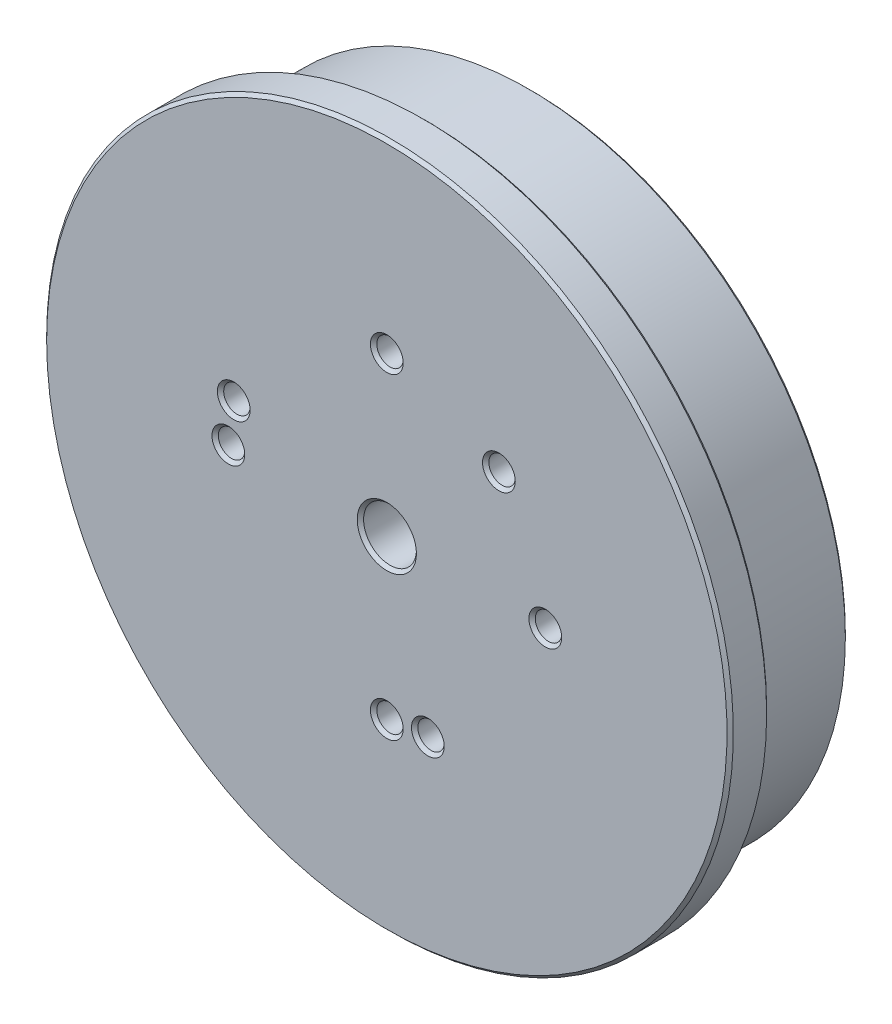
ISO-10303-21;
HEADER;
FILE_DESCRIPTION(('STEP AP214'),'2;1');
FILE_NAME('part.step','',(''),(''),'','','');
FILE_SCHEMA(('AUTOMOTIVE_DESIGN { 1 0 10303 214 1 1 1 1 }'));
ENDSEC;
DATA;
#1=APPLICATION_CONTEXT('core data for automotive mechanical design processes');
#2=APPLICATION_PROTOCOL_DEFINITION('international standard','automotive_design',2000,#1);
#3=PRODUCT_CONTEXT('',#1,'mechanical');
#4=PRODUCT('Part','Part','',(#3));
#5=PRODUCT_RELATED_PRODUCT_CATEGORY('part','',(#4));
#6=PRODUCT_DEFINITION_FORMATION('','',#4);
#7=PRODUCT_DEFINITION_CONTEXT('part definition',#1,'design');
#8=PRODUCT_DEFINITION('design','',#6,#7);
#9=PRODUCT_DEFINITION_SHAPE('','',#8);
#10=(LENGTH_UNIT() NAMED_UNIT(*) SI_UNIT(.MILLI.,.METRE.));
#11=(NAMED_UNIT(*) PLANE_ANGLE_UNIT() SI_UNIT($,.RADIAN.));
#12=(NAMED_UNIT(*) SI_UNIT($,.STERADIAN.) SOLID_ANGLE_UNIT());
#13=UNCERTAINTY_MEASURE_WITH_UNIT(LENGTH_MEASURE(1.E-05),#10,'distance_accuracy_value','');
#14=(GEOMETRIC_REPRESENTATION_CONTEXT(3) GLOBAL_UNCERTAINTY_ASSIGNED_CONTEXT((#13)) GLOBAL_UNIT_ASSIGNED_CONTEXT((#10,
#11,#12)) REPRESENTATION_CONTEXT('',''));
#15=CARTESIAN_POINT('',(0.,0.,0.));
#16=DIRECTION('',(0.,0.,1.));
#17=DIRECTION('',(1.,0.,0.));
#18=AXIS2_PLACEMENT_3D('',#15,#16,#17);
#19=CARTESIAN_POINT('',(0.,0.,25.4));
#20=DIRECTION('',(0.,0.,-1.));
#21=DIRECTION('',(-1.,0.,0.));
#22=AXIS2_PLACEMENT_3D('',#19,#20,#21);
#23=CYLINDRICAL_SURFACE('',#22,76.073);
#24=CARTESIAN_POINT('',(0.,0.,0.761999999999985));
#25=DIRECTION('',(0.,0.,1.));
#26=DIRECTION('',(1.,0.,0.));
#27=AXIS2_PLACEMENT_3D('',#24,#25,#26);
#28=CIRCLE('',#27,76.073);
#29=CARTESIAN_POINT('',(76.073,0.,0.761999999999985));
#30=VERTEX_POINT('',#29);
#31=EDGE_CURVE('E169',#30,#30,#28,.T.);
#32=ORIENTED_EDGE('',*,*,#31,.T.);
#33=EDGE_LOOP('',(#32));
#34=FACE_BOUND('',#33,.T.);
#35=CARTESIAN_POINT('',(0.,0.,25.4));
#36=DIRECTION('',(0.,0.,1.));
#37=DIRECTION('',(1.,0.,0.));
#38=AXIS2_PLACEMENT_3D('',#35,#36,#37);
#39=CIRCLE('',#38,76.073);
#40=CARTESIAN_POINT('',(76.073,0.,25.4));
#41=VERTEX_POINT('',#40);
#42=EDGE_CURVE('E172',#41,#41,#39,.T.);
#43=ORIENTED_EDGE('',*,*,#42,.F.);
#44=EDGE_LOOP('',(#43));
#45=FACE_BOUND('',#44,.T.);
#46=ADVANCED_FACE('F49',(#34,#45),#23,.T.);
#47=CARTESIAN_POINT('',(0.,0.,0.));
#48=DIRECTION('',(0.,0.,1.));
#49=DIRECTION('',(1.,0.,0.));
#50=AXIS2_PLACEMENT_3D('',#47,#48,#49);
#51=PLANE('',#50);
#52=CARTESIAN_POINT('',(0.,0.,0.));
#53=DIRECTION('',(0.,0.,1.));
#54=DIRECTION('',(1.,0.,0.));
#55=AXIS2_PLACEMENT_3D('',#52,#53,#54);
#56=CIRCLE('',#55,75.311);
#57=CARTESIAN_POINT('',(75.311,0.,0.));
#58=VERTEX_POINT('',#57);
#59=EDGE_CURVE('E142',#58,#58,#56,.F.);
#60=ORIENTED_EDGE('',*,*,#59,.T.);
#61=EDGE_LOOP('',(#60));
#62=FACE_BOUND('',#61,.T.);
#63=CARTESIAN_POINT('',(26.9407683632075,26.9407683632074,0.));
#64=DIRECTION('',(0.,0.,1.));
#65=DIRECTION('',(1.,0.,0.));
#66=AXIS2_PLACEMENT_3D('',#63,#64,#65);
#67=CIRCLE('',#66,3.937);
#68=CARTESIAN_POINT('',(30.8777683632075,26.9407683632074,0.));
#69=VERTEX_POINT('',#68);
#70=EDGE_CURVE('E145',#69,#69,#67,.T.);
#71=ORIENTED_EDGE('',*,*,#70,.T.);
#72=EDGE_LOOP('',(#71));
#73=FACE_BOUND('',#72,.T.);
#74=CARTESIAN_POINT('',(38.1,0.,0.));
#75=DIRECTION('',(0.,0.,1.));
#76=DIRECTION('',(1.,0.,0.));
#77=AXIS2_PLACEMENT_3D('',#74,#75,#76);
#78=CIRCLE('',#77,3.937);
#79=CARTESIAN_POINT('',(42.037,0.,0.));
#80=VERTEX_POINT('',#79);
#81=EDGE_CURVE('E148',#80,#80,#78,.T.);
#82=ORIENTED_EDGE('',*,*,#81,.T.);
#83=EDGE_LOOP('',(#82));
#84=FACE_BOUND('',#83,.T.);
#85=CARTESIAN_POINT('',(0.,38.1,0.));
#86=DIRECTION('',(0.,0.,1.));
#87=DIRECTION('',(1.,0.,0.));
#88=AXIS2_PLACEMENT_3D('',#85,#86,#87);
#89=CIRCLE('',#88,3.937);
#90=CARTESIAN_POINT('',(3.937,38.1,0.));
#91=VERTEX_POINT('',#90);
#92=EDGE_CURVE('E151',#91,#91,#89,.T.);
#93=ORIENTED_EDGE('',*,*,#92,.T.);
#94=EDGE_LOOP('',(#93));
#95=FACE_BOUND('',#94,.T.);
#96=CARTESIAN_POINT('',(9.86100561840581,-36.8017739816136,0.));
#97=DIRECTION('',(0.,0.,1.));
#98=DIRECTION('',(1.,0.,0.));
#99=AXIS2_PLACEMENT_3D('',#96,#97,#98);
#100=CIRCLE('',#99,3.937);
#101=CARTESIAN_POINT('',(13.7980056184058,-36.8017739816136,0.));
#102=VERTEX_POINT('',#101);
#103=EDGE_CURVE('E154',#102,#102,#100,.T.);
#104=ORIENTED_EDGE('',*,*,#103,.T.);
#105=EDGE_LOOP('',(#104));
#106=FACE_BOUND('',#105,.T.);
#107=CARTESIAN_POINT('',(0.,-38.1,0.));
#108=DIRECTION('',(0.,0.,1.));
#109=DIRECTION('',(1.,0.,0.));
#110=AXIS2_PLACEMENT_3D('',#107,#108,#109);
#111=CIRCLE('',#110,3.937);
#112=CARTESIAN_POINT('',(3.937,-38.1,0.));
#113=VERTEX_POINT('',#112);
#114=EDGE_CURVE('E157',#113,#113,#111,.T.);
#115=ORIENTED_EDGE('',*,*,#114,.T.);
#116=EDGE_LOOP('',(#115));
#117=FACE_BOUND('',#116,.T.);
#118=CARTESIAN_POINT('',(-38.1,0.,0.));
#119=DIRECTION('',(0.,0.,1.));
#120=DIRECTION('',(1.,0.,0.));
#121=AXIS2_PLACEMENT_3D('',#118,#119,#120);
#122=CIRCLE('',#121,3.93700000000002);
#123=CARTESIAN_POINT('',(-34.163,0.,0.));
#124=VERTEX_POINT('',#123);
#125=EDGE_CURVE('E160',#124,#124,#122,.T.);
#126=ORIENTED_EDGE('',*,*,#125,.T.);
#127=EDGE_LOOP('',(#126));
#128=FACE_BOUND('',#127,.T.);
#129=CARTESIAN_POINT('',(-36.8017739816134,9.86100561840645,0.));
#130=DIRECTION('',(0.,0.,1.));
#131=DIRECTION('',(1.,0.,0.));
#132=AXIS2_PLACEMENT_3D('',#129,#130,#131);
#133=CIRCLE('',#132,3.937);
#134=CARTESIAN_POINT('',(-32.8647739816134,9.86100561840645,0.));
#135=VERTEX_POINT('',#134);
#136=EDGE_CURVE('E163',#135,#135,#133,.T.);
#137=ORIENTED_EDGE('',*,*,#136,.T.);
#138=EDGE_LOOP('',(#137));
#139=FACE_BOUND('',#138,.T.);
#140=CARTESIAN_POINT('',(0.,0.,0.));
#141=DIRECTION('',(0.,0.,1.));
#142=DIRECTION('',(1.,0.,0.));
#143=AXIS2_PLACEMENT_3D('',#140,#141,#142);
#144=CIRCLE('',#143,7.11200000000003);
#145=CARTESIAN_POINT('',(7.11200000000003,0.,0.));
#146=VERTEX_POINT('',#145);
#147=EDGE_CURVE('E166',#146,#146,#144,.T.);
#148=ORIENTED_EDGE('',*,*,#147,.T.);
#149=EDGE_LOOP('',(#148));
#150=FACE_BOUND('',#149,.T.);
#151=ADVANCED_FACE('F179',(#62,#73,#84,#95,#106,#117,#128,#139,#150),#51,.F.);
#152=CARTESIAN_POINT('',(0.,0.,34.925));
#153=DIRECTION('',(0.,0.,-1.));
#154=DIRECTION('',(-1.,0.,0.));
#155=AXIS2_PLACEMENT_3D('',#152,#153,#154);
#156=CYLINDRICAL_SURFACE('',#155,82.55);
#157=CARTESIAN_POINT('',(0.,0.,34.1630000000001));
#158=DIRECTION('',(0.,0.,1.));
#159=DIRECTION('',(1.,0.,0.));
#160=AXIS2_PLACEMENT_3D('',#157,#158,#159);
#161=CIRCLE('',#160,82.55);
#162=CARTESIAN_POINT('',(-82.55,0.,34.1630000000001));
#163=VERTEX_POINT('',#162);
#164=EDGE_CURVE('E57',#163,#163,#161,.F.);
#165=CARTESIAN_POINT('',(0.,0.,26.1620000000001));
#166=DIRECTION('',(0.,0.,1.));
#167=DIRECTION('',(1.,0.,0.));
#168=AXIS2_PLACEMENT_3D('',#165,#166,#167);
#169=CIRCLE('',#168,82.55);
#170=CARTESIAN_POINT('',(-82.55,0.,26.1620000000001));
#171=VERTEX_POINT('',#170);
#172=EDGE_CURVE('E61',#171,#171,#169,.T.);
#173=CARTESIAN_POINT('',(-82.55,0.,34.1630000000001));
#174=CARTESIAN_POINT('',(-82.55,0.,34.0796562500001));
#175=CARTESIAN_POINT('',(-82.55,0.,33.9963125000001));
#176=CARTESIAN_POINT('',(-82.55,0.,33.8296250000001));
#177=CARTESIAN_POINT('',(-82.55,0.,33.7462812500001));
#178=CARTESIAN_POINT('',(-82.55,0.,33.5795937500001));
#179=CARTESIAN_POINT('',(-82.55,0.,33.4962500000001));
#180=CARTESIAN_POINT('',(-82.55,0.,33.3295625000001));
#181=CARTESIAN_POINT('',(-82.55,0.,33.2462187500001));
#182=CARTESIAN_POINT('',(-82.55,0.,33.0795312500001));
#183=CARTESIAN_POINT('',(-82.55,0.,32.9961875000001));
#184=CARTESIAN_POINT('',(-82.55,0.,32.8295000000001));
#185=CARTESIAN_POINT('',(-82.55,0.,32.7461562500001));
#186=CARTESIAN_POINT('',(-82.55,0.,32.5794687500001));
#187=CARTESIAN_POINT('',(-82.55,0.,32.4961250000001));
#188=CARTESIAN_POINT('',(-82.55,0.,32.3294375000001));
#189=CARTESIAN_POINT('',(-82.55,0.,32.2460937500001));
#190=CARTESIAN_POINT('',(-82.55,0.,32.0794062500001));
#191=CARTESIAN_POINT('',(-82.55,0.,31.9960625000001));
#192=CARTESIAN_POINT('',(-82.55,0.,31.8293750000001));
#193=CARTESIAN_POINT('',(-82.55,0.,31.7460312500001));
#194=CARTESIAN_POINT('',(-82.55,0.,31.5793437500001));
#195=CARTESIAN_POINT('',(-82.55,0.,31.4960000000001));
#196=CARTESIAN_POINT('',(-82.55,0.,31.3293125000001));
#197=CARTESIAN_POINT('',(-82.55,0.,31.2459687500001));
#198=CARTESIAN_POINT('',(-82.55,0.,31.0792812500001));
#199=CARTESIAN_POINT('',(-82.55,0.,30.9959375000001));
#200=CARTESIAN_POINT('',(-82.55,0.,30.8292500000001));
#201=CARTESIAN_POINT('',(-82.55,0.,30.7459062500001));
#202=CARTESIAN_POINT('',(-82.55,0.,30.5792187500001));
#203=CARTESIAN_POINT('',(-82.55,0.,30.4958750000001));
#204=CARTESIAN_POINT('',(-82.55,0.,30.3291875000001));
#205=CARTESIAN_POINT('',(-82.55,0.,30.2458437500001));
#206=CARTESIAN_POINT('',(-82.55,0.,30.0791562500001));
#207=CARTESIAN_POINT('',(-82.55,0.,29.9958125000001));
#208=CARTESIAN_POINT('',(-82.55,0.,29.8291250000001));
#209=CARTESIAN_POINT('',(-82.55,0.,29.7457812500001));
#210=CARTESIAN_POINT('',(-82.55,0.,29.5790937500001));
#211=CARTESIAN_POINT('',(-82.55,0.,29.4957500000001));
#212=CARTESIAN_POINT('',(-82.55,0.,29.3290625000001));
#213=CARTESIAN_POINT('',(-82.55,0.,29.2457187500001));
#214=CARTESIAN_POINT('',(-82.55,0.,29.0790312500001));
#215=CARTESIAN_POINT('',(-82.55,0.,28.9956875000001));
#216=CARTESIAN_POINT('',(-82.55,0.,28.8290000000001));
#217=CARTESIAN_POINT('',(-82.55,0.,28.7456562500001));
#218=CARTESIAN_POINT('',(-82.55,0.,28.5789687500001));
#219=CARTESIAN_POINT('',(-82.55,0.,28.4956250000001));
#220=CARTESIAN_POINT('',(-82.55,0.,28.3289375000001));
#221=CARTESIAN_POINT('',(-82.55,0.,28.2455937500001));
#222=CARTESIAN_POINT('',(-82.55,0.,28.0789062500001));
#223=CARTESIAN_POINT('',(-82.55,0.,27.9955625000001));
#224=CARTESIAN_POINT('',(-82.55,0.,27.8288750000001));
#225=CARTESIAN_POINT('',(-82.55,0.,27.7455312500001));
#226=CARTESIAN_POINT('',(-82.55,0.,27.5788437500001));
#227=CARTESIAN_POINT('',(-82.55,0.,27.4955000000001));
#228=CARTESIAN_POINT('',(-82.55,0.,27.3288125000001));
#229=CARTESIAN_POINT('',(-82.55,0.,27.2454687500001));
#230=CARTESIAN_POINT('',(-82.55,0.,27.0787812500001));
#231=CARTESIAN_POINT('',(-82.55,0.,26.9954375000001));
#232=CARTESIAN_POINT('',(-82.55,0.,26.8287500000001));
#233=CARTESIAN_POINT('',(-82.55,0.,26.7454062500001));
#234=CARTESIAN_POINT('',(-82.55,0.,26.5787187500001));
#235=CARTESIAN_POINT('',(-82.55,0.,26.4953750000001));
#236=CARTESIAN_POINT('',(-82.55,0.,26.3286875000001));
#237=CARTESIAN_POINT('',(-82.55,0.,26.2453437500001));
#238=CARTESIAN_POINT('',(-82.55,0.,26.1620000000001));
#239=B_SPLINE_CURVE_WITH_KNOTS('',3,(#173,#174,#175,#176,#177,#178,#179,#180,#181,#182,#183,
#184,#185,#186,#187,#188,#189,#190,#191,#192,#193,#194,#195,#196,#197,#198,#199,#200,#201,#202,
#203,#204,#205,#206,#207,#208,#209,#210,#211,#212,#213,#214,#215,#216,#217,#218,#219,#220,#221,
#222,#223,#224,#225,#226,#227,#228,#229,#230,#231,#232,#233,#234,#235,#236,#237,#238),
.UNSPECIFIED.,.F.,.F.,(4,2,2,2,2,2,2,2,2,2,2,2,2,2,2,2,2,2,2,2,2,2,2,2,2,2,2,2,2,2,2,2,4),(0.,
0.250031249999998,0.500062499999995,0.75009375,1.000125,1.25015625,1.5001875,1.75021875,2.00025,
2.25028125,2.5003125,2.75034375,3.000375,3.25040625,3.5004375,3.75046875,4.0005,4.25053125,
4.5005625,4.75059375,5.000625,5.25065625000001,5.50068750000001,5.75071875000001,
6.00075000000001,6.25078125000001,6.50081250000001,6.75084375000001,7.00087500000001,
7.25090625000001,7.50093750000001,7.75096875000001,8.00100000000001),.UNSPECIFIED.);
#240=EDGE_CURVE('BSEAM185',#163,#171,#239,.T.);
#241=ORIENTED_EDGE('',*,*,#164,.T.);
#242=ORIENTED_EDGE('',*,*,#172,.T.);
#243=ORIENTED_EDGE('',*,*,#240,.T.);
#244=ORIENTED_EDGE('',*,*,#240,.F.);
#245=EDGE_LOOP('',(#241,#243,#242,#244));
#246=FACE_BOUND('',#245,.T.);
#247=ADVANCED_FACE('F185',(#246),#156,.T.);
#248=CARTESIAN_POINT('',(0.,0.,34.925));
#249=DIRECTION('',(0.,0.,1.));
#250=DIRECTION('',(1.,0.,0.));
#251=AXIS2_PLACEMENT_3D('',#248,#249,#250);
#252=PLANE('',#251);
#253=CARTESIAN_POINT('',(0.,0.,34.925));
#254=DIRECTION('',(0.,0.,1.));
#255=DIRECTION('',(1.,0.,0.));
#256=AXIS2_PLACEMENT_3D('',#253,#254,#255);
#257=CIRCLE('',#256,81.7880000000001);
#258=CARTESIAN_POINT('',(-81.7880000000001,0.,34.925));
#259=VERTEX_POINT('',#258);
#260=EDGE_CURVE('E65',#259,#259,#257,.T.);
#261=ORIENTED_EDGE('',*,*,#260,.T.);
#262=EDGE_LOOP('',(#261));
#263=FACE_BOUND('',#262,.T.);
#264=CARTESIAN_POINT('',(26.9407683632075,26.9407683632074,34.925));
#265=DIRECTION('',(0.,0.,1.));
#266=DIRECTION('',(1.,0.,0.));
#267=AXIS2_PLACEMENT_3D('',#264,#265,#266);
#268=CIRCLE('',#267,3.93700000000005);
#269=CARTESIAN_POINT('',(30.8777683632076,26.9407683632074,34.925));
#270=VERTEX_POINT('',#269);
#271=EDGE_CURVE('E70',#270,#270,#268,.F.);
#272=ORIENTED_EDGE('',*,*,#271,.T.);
#273=EDGE_LOOP('',(#272));
#274=FACE_BOUND('',#273,.T.);
#275=CARTESIAN_POINT('',(38.1,0.,34.925));
#276=DIRECTION('',(0.,0.,1.));
#277=DIRECTION('',(1.,0.,0.));
#278=AXIS2_PLACEMENT_3D('',#275,#276,#277);
#279=CIRCLE('',#278,3.93700000000005);
#280=CARTESIAN_POINT('',(42.0370000000001,0.,34.925));
#281=VERTEX_POINT('',#280);
#282=EDGE_CURVE('E73',#281,#281,#279,.F.);
#283=ORIENTED_EDGE('',*,*,#282,.T.);
#284=EDGE_LOOP('',(#283));
#285=FACE_BOUND('',#284,.T.);
#286=CARTESIAN_POINT('',(0.,38.1,34.925));
#287=DIRECTION('',(0.,0.,1.));
#288=DIRECTION('',(1.,0.,0.));
#289=AXIS2_PLACEMENT_3D('',#286,#287,#288);
#290=CIRCLE('',#289,3.93700000000005);
#291=CARTESIAN_POINT('',(3.93700000000005,38.1,34.925));
#292=VERTEX_POINT('',#291);
#293=EDGE_CURVE('E76',#292,#292,#290,.F.);
#294=ORIENTED_EDGE('',*,*,#293,.T.);
#295=EDGE_LOOP('',(#294));
#296=FACE_BOUND('',#295,.T.);
#297=CARTESIAN_POINT('',(9.86100561840581,-36.8017739816136,34.925));
#298=DIRECTION('',(0.,0.,1.));
#299=DIRECTION('',(1.,0.,0.));
#300=AXIS2_PLACEMENT_3D('',#297,#298,#299);
#301=CIRCLE('',#300,3.93700000000005);
#302=CARTESIAN_POINT('',(13.7980056184059,-36.8017739816136,34.925));
#303=VERTEX_POINT('',#302);
#304=EDGE_CURVE('E79',#303,#303,#301,.F.);
#305=ORIENTED_EDGE('',*,*,#304,.T.);
#306=EDGE_LOOP('',(#305));
#307=FACE_BOUND('',#306,.T.);
#308=CARTESIAN_POINT('',(0.,-38.1,34.925));
#309=DIRECTION('',(0.,0.,1.));
#310=DIRECTION('',(1.,0.,0.));
#311=AXIS2_PLACEMENT_3D('',#308,#309,#310);
#312=CIRCLE('',#311,3.93700000000005);
#313=CARTESIAN_POINT('',(3.93700000000006,-38.1,34.925));
#314=VERTEX_POINT('',#313);
#315=EDGE_CURVE('E82',#314,#314,#312,.F.);
#316=ORIENTED_EDGE('',*,*,#315,.T.);
#317=EDGE_LOOP('',(#316));
#318=FACE_BOUND('',#317,.T.);
#319=CARTESIAN_POINT('',(-38.1,0.,34.925));
#320=DIRECTION('',(0.,0.,1.));
#321=DIRECTION('',(1.,0.,0.));
#322=AXIS2_PLACEMENT_3D('',#319,#320,#321);
#323=CIRCLE('',#322,3.93700000000005);
#324=CARTESIAN_POINT('',(-34.1629999999999,0.,34.925));
#325=VERTEX_POINT('',#324);
#326=EDGE_CURVE('E85',#325,#325,#323,.F.);
#327=ORIENTED_EDGE('',*,*,#326,.T.);
#328=EDGE_LOOP('',(#327));
#329=FACE_BOUND('',#328,.T.);
#330=CARTESIAN_POINT('',(-36.8017739816134,9.86100561840645,34.925));
#331=DIRECTION('',(0.,0.,1.));
#332=DIRECTION('',(1.,0.,0.));
#333=AXIS2_PLACEMENT_3D('',#330,#331,#332);
#334=CIRCLE('',#333,3.93700000000005);
#335=CARTESIAN_POINT('',(-32.8647739816133,9.86100561840645,34.925));
#336=VERTEX_POINT('',#335);
#337=EDGE_CURVE('E88',#336,#336,#334,.F.);
#338=ORIENTED_EDGE('',*,*,#337,.T.);
#339=EDGE_LOOP('',(#338));
#340=FACE_BOUND('',#339,.T.);
#341=CARTESIAN_POINT('',(0.,0.,34.925));
#342=DIRECTION('',(0.,0.,1.));
#343=DIRECTION('',(1.,0.,0.));
#344=AXIS2_PLACEMENT_3D('',#341,#342,#343);
#345=CIRCLE('',#344,7.11200000000001);
#346=CARTESIAN_POINT('',(7.112,0.,34.925));
#347=VERTEX_POINT('',#346);
#348=EDGE_CURVE('E91',#347,#347,#345,.F.);
#349=ORIENTED_EDGE('',*,*,#348,.T.);
#350=EDGE_LOOP('',(#349));
#351=FACE_BOUND('',#350,.T.);
#352=ADVANCED_FACE('F357',(#263,#274,#285,#296,#307,#318,#329,#340,#351),#252,.T.);
#353=CARTESIAN_POINT('',(0.,0.,25.4));
#354=DIRECTION('',(0.,0.,1.));
#355=DIRECTION('',(1.,0.,0.));
#356=AXIS2_PLACEMENT_3D('',#353,#354,#355);
#357=PLANE('',#356);
#358=CARTESIAN_POINT('',(0.,0.,25.4));
#359=DIRECTION('',(0.,0.,1.));
#360=DIRECTION('',(1.,0.,0.));
#361=AXIS2_PLACEMENT_3D('',#358,#359,#360);
#362=CIRCLE('',#361,81.7879999999999);
#363=CARTESIAN_POINT('',(81.7879999999999,0.,25.4));
#364=VERTEX_POINT('',#363);
#365=EDGE_CURVE('E10',#364,#364,#362,.F.);
#366=ORIENTED_EDGE('',*,*,#365,.T.);
#367=EDGE_LOOP('',(#366));
#368=FACE_BOUND('',#367,.T.);
#369=ORIENTED_EDGE('',*,*,#42,.T.);
#370=EDGE_LOOP('',(#369));
#371=FACE_BOUND('',#370,.T.);
#372=ADVANCED_FACE('F176',(#368,#371),#357,.F.);
#373=CARTESIAN_POINT('',(26.9407683632075,26.9407683632074,0.));
#374=DIRECTION('',(0.,0.,1.));
#375=DIRECTION('',(1.,0.,0.));
#376=AXIS2_PLACEMENT_3D('',#373,#374,#375);
#377=CYLINDRICAL_SURFACE('',#376,3.175);
#378=CARTESIAN_POINT('',(26.9407683632075,26.9407683632074,0.762000000000008));
#379=DIRECTION('',(0.,0.,1.));
#380=DIRECTION('',(1.,0.,0.));
#381=AXIS2_PLACEMENT_3D('',#378,#379,#380);
#382=CIRCLE('',#381,3.175);
#383=CARTESIAN_POINT('',(30.1157683632075,26.9407683632074,0.762000000000008));
#384=VERTEX_POINT('',#383);
#385=EDGE_CURVE('E136',#384,#384,#382,.F.);
#386=ORIENTED_EDGE('',*,*,#385,.T.);
#387=EDGE_LOOP('',(#386));
#388=FACE_BOUND('',#387,.T.);
#389=CARTESIAN_POINT('',(26.9407683632075,26.9407683632074,34.163));
#390=DIRECTION('',(0.,0.,1.));
#391=DIRECTION('',(1.,0.,0.));
#392=AXIS2_PLACEMENT_3D('',#389,#390,#391);
#393=CIRCLE('',#392,3.175);
#394=CARTESIAN_POINT('',(30.1157683632075,26.9407683632074,34.163));
#395=VERTEX_POINT('',#394);
#396=EDGE_CURVE('E139',#395,#395,#393,.T.);
#397=ORIENTED_EDGE('',*,*,#396,.T.);
#398=EDGE_LOOP('',(#397));
#399=FACE_BOUND('',#398,.T.);
#400=ADVANCED_FACE('F338',(#388,#399),#377,.F.);
#401=CARTESIAN_POINT('',(38.1,0.,0.));
#402=DIRECTION('',(0.,0.,1.));
#403=DIRECTION('',(1.,0.,0.));
#404=AXIS2_PLACEMENT_3D('',#401,#402,#403);
#405=CYLINDRICAL_SURFACE('',#404,3.175);
#406=CARTESIAN_POINT('',(38.1,0.,0.761999999999981));
#407=DIRECTION('',(0.,0.,1.));
#408=DIRECTION('',(1.,0.,0.));
#409=AXIS2_PLACEMENT_3D('',#406,#407,#408);
#410=CIRCLE('',#409,3.175);
#411=CARTESIAN_POINT('',(41.275,0.,0.761999999999981));
#412=VERTEX_POINT('',#411);
#413=EDGE_CURVE('E130',#412,#412,#410,.F.);
#414=ORIENTED_EDGE('',*,*,#413,.T.);
#415=EDGE_LOOP('',(#414));
#416=FACE_BOUND('',#415,.T.);
#417=CARTESIAN_POINT('',(38.1,0.,34.163));
#418=DIRECTION('',(0.,0.,1.));
#419=DIRECTION('',(1.,0.,0.));
#420=AXIS2_PLACEMENT_3D('',#417,#418,#419);
#421=CIRCLE('',#420,3.175);
#422=CARTESIAN_POINT('',(41.275,0.,34.163));
#423=VERTEX_POINT('',#422);
#424=EDGE_CURVE('E133',#423,#423,#421,.T.);
#425=ORIENTED_EDGE('',*,*,#424,.T.);
#426=EDGE_LOOP('',(#425));
#427=FACE_BOUND('',#426,.T.);
#428=ADVANCED_FACE('F334',(#416,#427),#405,.F.);
#429=CARTESIAN_POINT('',(0.,38.1,0.));
#430=DIRECTION('',(0.,0.,1.));
#431=DIRECTION('',(1.,0.,0.));
#432=AXIS2_PLACEMENT_3D('',#429,#430,#431);
#433=CYLINDRICAL_SURFACE('',#432,3.175);
#434=CARTESIAN_POINT('',(0.,38.1,0.761999999999987));
#435=DIRECTION('',(0.,0.,1.));
#436=DIRECTION('',(1.,0.,0.));
#437=AXIS2_PLACEMENT_3D('',#434,#435,#436);
#438=CIRCLE('',#437,3.175);
#439=CARTESIAN_POINT('',(3.175,38.1,0.761999999999987));
#440=VERTEX_POINT('',#439);
#441=EDGE_CURVE('E124',#440,#440,#438,.F.);
#442=ORIENTED_EDGE('',*,*,#441,.T.);
#443=EDGE_LOOP('',(#442));
#444=FACE_BOUND('',#443,.T.);
#445=CARTESIAN_POINT('',(0.,38.1,34.163));
#446=DIRECTION('',(0.,0.,1.));
#447=DIRECTION('',(1.,0.,0.));
#448=AXIS2_PLACEMENT_3D('',#445,#446,#447);
#449=CIRCLE('',#448,3.175);
#450=CARTESIAN_POINT('',(3.175,38.1,34.163));
#451=VERTEX_POINT('',#450);
#452=EDGE_CURVE('E127',#451,#451,#449,.T.);
#453=ORIENTED_EDGE('',*,*,#452,.T.);
#454=EDGE_LOOP('',(#453));
#455=FACE_BOUND('',#454,.T.);
#456=ADVANCED_FACE('F337',(#444,#455),#433,.F.);
#457=CARTESIAN_POINT('',(9.86100561840581,-36.8017739816136,0.));
#458=DIRECTION('',(0.,0.,1.));
#459=DIRECTION('',(1.,0.,0.));
#460=AXIS2_PLACEMENT_3D('',#457,#458,#459);
#461=CYLINDRICAL_SURFACE('',#460,3.175);
#462=CARTESIAN_POINT('',(9.86100561840581,-36.8017739816136,0.761999999999986));
#463=DIRECTION('',(0.,0.,1.));
#464=DIRECTION('',(1.,0.,0.));
#465=AXIS2_PLACEMENT_3D('',#462,#463,#464);
#466=CIRCLE('',#465,3.175);
#467=CARTESIAN_POINT('',(13.0360056184058,-36.8017739816136,0.761999999999986));
#468=VERTEX_POINT('',#467);
#469=EDGE_CURVE('E118',#468,#468,#466,.F.);
#470=ORIENTED_EDGE('',*,*,#469,.T.);
#471=EDGE_LOOP('',(#470));
#472=FACE_BOUND('',#471,.T.);
#473=CARTESIAN_POINT('',(9.86100561840581,-36.8017739816136,34.163));
#474=DIRECTION('',(0.,0.,1.));
#475=DIRECTION('',(1.,0.,0.));
#476=AXIS2_PLACEMENT_3D('',#473,#474,#475);
#477=CIRCLE('',#476,3.175);
#478=CARTESIAN_POINT('',(13.0360056184058,-36.8017739816136,34.163));
#479=VERTEX_POINT('',#478);
#480=EDGE_CURVE('E121',#479,#479,#477,.T.);
#481=ORIENTED_EDGE('',*,*,#480,.T.);
#482=EDGE_LOOP('',(#481));
#483=FACE_BOUND('',#482,.T.);
#484=ADVANCED_FACE('F342',(#472,#483),#461,.F.);
#485=CARTESIAN_POINT('',(0.,-38.1,0.));
#486=DIRECTION('',(0.,0.,1.));
#487=DIRECTION('',(1.,0.,0.));
#488=AXIS2_PLACEMENT_3D('',#485,#486,#487);
#489=CYLINDRICAL_SURFACE('',#488,3.175);
#490=CARTESIAN_POINT('',(0.,-38.1,0.761999999999987));
#491=DIRECTION('',(0.,0.,1.));
#492=DIRECTION('',(1.,0.,0.));
#493=AXIS2_PLACEMENT_3D('',#490,#491,#492);
#494=CIRCLE('',#493,3.175);
#495=CARTESIAN_POINT('',(3.175,-38.1,0.761999999999987));
#496=VERTEX_POINT('',#495);
#497=EDGE_CURVE('E112',#496,#496,#494,.F.);
#498=ORIENTED_EDGE('',*,*,#497,.T.);
#499=EDGE_LOOP('',(#498));
#500=FACE_BOUND('',#499,.T.);
#501=CARTESIAN_POINT('',(0.,-38.1,34.163));
#502=DIRECTION('',(0.,0.,1.));
#503=DIRECTION('',(1.,0.,0.));
#504=AXIS2_PLACEMENT_3D('',#501,#502,#503);
#505=CIRCLE('',#504,3.175);
#506=CARTESIAN_POINT('',(3.175,-38.1,34.163));
#507=VERTEX_POINT('',#506);
#508=EDGE_CURVE('E115',#507,#507,#505,.T.);
#509=ORIENTED_EDGE('',*,*,#508,.T.);
#510=EDGE_LOOP('',(#509));
#511=FACE_BOUND('',#510,.T.);
#512=ADVANCED_FACE('F346',(#500,#511),#489,.F.);
#513=CARTESIAN_POINT('',(-38.1,0.,0.));
#514=DIRECTION('',(0.,0.,1.));
#515=DIRECTION('',(1.,0.,0.));
#516=AXIS2_PLACEMENT_3D('',#513,#514,#515);
#517=CYLINDRICAL_SURFACE('',#516,3.175);
#518=CARTESIAN_POINT('',(-38.1,0.,0.762000000000009));
#519=DIRECTION('',(0.,0.,1.));
#520=DIRECTION('',(1.,0.,0.));
#521=AXIS2_PLACEMENT_3D('',#518,#519,#520);
#522=CIRCLE('',#521,3.175);
#523=CARTESIAN_POINT('',(-34.925,0.,0.762000000000009));
#524=VERTEX_POINT('',#523);
#525=EDGE_CURVE('E106',#524,#524,#522,.F.);
#526=ORIENTED_EDGE('',*,*,#525,.T.);
#527=EDGE_LOOP('',(#526));
#528=FACE_BOUND('',#527,.T.);
#529=CARTESIAN_POINT('',(-38.1,0.,34.163));
#530=DIRECTION('',(0.,0.,1.));
#531=DIRECTION('',(1.,0.,0.));
#532=AXIS2_PLACEMENT_3D('',#529,#530,#531);
#533=CIRCLE('',#532,3.175);
#534=CARTESIAN_POINT('',(-34.925,0.,34.163));
#535=VERTEX_POINT('',#534);
#536=EDGE_CURVE('E109',#535,#535,#533,.T.);
#537=ORIENTED_EDGE('',*,*,#536,.T.);
#538=EDGE_LOOP('',(#537));
#539=FACE_BOUND('',#538,.T.);
#540=ADVANCED_FACE('F330',(#528,#539),#517,.F.);
#541=CARTESIAN_POINT('',(-36.8017739816134,9.86100561840645,0.));
#542=DIRECTION('',(0.,0.,1.));
#543=DIRECTION('',(1.,0.,0.));
#544=AXIS2_PLACEMENT_3D('',#541,#542,#543);
#545=CYLINDRICAL_SURFACE('',#544,3.175);
#546=CARTESIAN_POINT('',(-36.8017739816134,9.86100561840645,0.761999999999981));
#547=DIRECTION('',(0.,0.,1.));
#548=DIRECTION('',(1.,0.,0.));
#549=AXIS2_PLACEMENT_3D('',#546,#547,#548);
#550=CIRCLE('',#549,3.175);
#551=CARTESIAN_POINT('',(-33.6267739816134,9.86100561840645,0.761999999999981));
#552=VERTEX_POINT('',#551);
#553=EDGE_CURVE('E100',#552,#552,#550,.F.);
#554=ORIENTED_EDGE('',*,*,#553,.T.);
#555=EDGE_LOOP('',(#554));
#556=FACE_BOUND('',#555,.T.);
#557=CARTESIAN_POINT('',(-36.8017739816134,9.86100561840645,34.163));
#558=DIRECTION('',(0.,0.,1.));
#559=DIRECTION('',(1.,0.,0.));
#560=AXIS2_PLACEMENT_3D('',#557,#558,#559);
#561=CIRCLE('',#560,3.175);
#562=CARTESIAN_POINT('',(-33.6267739816134,9.86100561840645,34.163));
#563=VERTEX_POINT('',#562);
#564=EDGE_CURVE('E103',#563,#563,#561,.T.);
#565=ORIENTED_EDGE('',*,*,#564,.T.);
#566=EDGE_LOOP('',(#565));
#567=FACE_BOUND('',#566,.T.);
#568=ADVANCED_FACE('F324',(#556,#567),#545,.F.);
#569=CARTESIAN_POINT('',(0.,0.,0.));
#570=DIRECTION('',(0.,0.,1.));
#571=DIRECTION('',(1.,0.,0.));
#572=AXIS2_PLACEMENT_3D('',#569,#570,#571);
#573=CYLINDRICAL_SURFACE('',#572,6.35);
#574=CARTESIAN_POINT('',(0.,0.,0.762000000000041));
#575=DIRECTION('',(0.,0.,1.));
#576=DIRECTION('',(1.,0.,0.));
#577=AXIS2_PLACEMENT_3D('',#574,#575,#576);
#578=CIRCLE('',#577,6.35);
#579=CARTESIAN_POINT('',(6.35,0.,0.762000000000041));
#580=VERTEX_POINT('',#579);
#581=EDGE_CURVE('E94',#580,#580,#578,.F.);
#582=ORIENTED_EDGE('',*,*,#581,.T.);
#583=EDGE_LOOP('',(#582));
#584=FACE_BOUND('',#583,.T.);
#585=CARTESIAN_POINT('',(0.,0.,34.163));
#586=DIRECTION('',(0.,0.,1.));
#587=DIRECTION('',(1.,0.,0.));
#588=AXIS2_PLACEMENT_3D('',#585,#586,#587);
#589=CIRCLE('',#588,6.35);
#590=CARTESIAN_POINT('',(6.35,0.,34.163));
#591=VERTEX_POINT('',#590);
#592=EDGE_CURVE('E97',#591,#591,#589,.T.);
#593=ORIENTED_EDGE('',*,*,#592,.T.);
#594=EDGE_LOOP('',(#593));
#595=FACE_BOUND('',#594,.T.);
#596=ADVANCED_FACE('F198',(#584,#595),#573,.F.);
#597=CARTESIAN_POINT('',(0.,0.,0.761999999999985));
#598=DIRECTION('',(0.,0.,1.));
#599=DIRECTION('',(1.,0.,0.));
#600=AXIS2_PLACEMENT_3D('',#597,#598,#599);
#601=CONICAL_SURFACE('',#600,76.073,0.785398163397439);
#602=ORIENTED_EDGE('',*,*,#59,.F.);
#603=EDGE_LOOP('',(#602));
#604=FACE_BOUND('',#603,.T.);
#605=ORIENTED_EDGE('',*,*,#31,.F.);
#606=EDGE_LOOP('',(#605));
#607=FACE_BOUND('',#606,.T.);
#608=ADVANCED_FACE('F191',(#604,#607),#601,.T.);
#609=CARTESIAN_POINT('',(26.9407683632075,26.9407683632074,0.));
#610=DIRECTION('',(0.,0.,-1.));
#611=DIRECTION('',(-1.,0.,0.));
#612=AXIS2_PLACEMENT_3D('',#609,#610,#611);
#613=CONICAL_SURFACE('',#612,3.937,0.785398163397442);
#614=ORIENTED_EDGE('',*,*,#385,.F.);
#615=EDGE_LOOP('',(#614));
#616=FACE_BOUND('',#615,.T.);
#617=ORIENTED_EDGE('',*,*,#70,.F.);
#618=EDGE_LOOP('',(#617));
#619=FACE_BOUND('',#618,.T.);
#620=ADVANCED_FACE('F197',(#616,#619),#613,.F.);
#621=CARTESIAN_POINT('',(38.1,0.,0.));
#622=DIRECTION('',(0.,0.,-1.));
#623=DIRECTION('',(-1.,0.,0.));
#624=AXIS2_PLACEMENT_3D('',#621,#622,#623);
#625=CONICAL_SURFACE('',#624,3.937,0.785398163397459);
#626=ORIENTED_EDGE('',*,*,#413,.F.);
#627=EDGE_LOOP('',(#626));
#628=FACE_BOUND('',#627,.T.);
#629=ORIENTED_EDGE('',*,*,#81,.F.);
#630=EDGE_LOOP('',(#629));
#631=FACE_BOUND('',#630,.T.);
#632=ADVANCED_FACE('F205',(#628,#631),#625,.F.);
#633=CARTESIAN_POINT('',(0.,38.1,0.));
#634=DIRECTION('',(0.,0.,-1.));
#635=DIRECTION('',(-1.,0.,0.));
#636=AXIS2_PLACEMENT_3D('',#633,#634,#635);
#637=CONICAL_SURFACE('',#636,3.937,0.785398163397455);
#638=ORIENTED_EDGE('',*,*,#441,.F.);
#639=EDGE_LOOP('',(#638));
#640=FACE_BOUND('',#639,.T.);
#641=ORIENTED_EDGE('',*,*,#92,.F.);
#642=EDGE_LOOP('',(#641));
#643=FACE_BOUND('',#642,.T.);
#644=ADVANCED_FACE('F212',(#640,#643),#637,.F.);
#645=CARTESIAN_POINT('',(9.86100561840581,-36.8017739816136,0.));
#646=DIRECTION('',(0.,0.,-1.));
#647=DIRECTION('',(-1.,0.,0.));
#648=AXIS2_PLACEMENT_3D('',#645,#646,#647);
#649=CONICAL_SURFACE('',#648,3.937,0.785398163397455);
#650=ORIENTED_EDGE('',*,*,#469,.F.);
#651=EDGE_LOOP('',(#650));
#652=FACE_BOUND('',#651,.T.);
#653=ORIENTED_EDGE('',*,*,#103,.F.);
#654=EDGE_LOOP('',(#653));
#655=FACE_BOUND('',#654,.T.);
#656=ADVANCED_FACE('F219',(#652,#655),#649,.F.);
#657=CARTESIAN_POINT('',(0.,-38.1,0.));
#658=DIRECTION('',(0.,0.,-1.));
#659=DIRECTION('',(-1.,0.,0.));
#660=AXIS2_PLACEMENT_3D('',#657,#658,#659);
#661=CONICAL_SURFACE('',#660,3.937,0.785398163397455);
#662=ORIENTED_EDGE('',*,*,#497,.F.);
#663=EDGE_LOOP('',(#662));
#664=FACE_BOUND('',#663,.T.);
#665=ORIENTED_EDGE('',*,*,#114,.F.);
#666=EDGE_LOOP('',(#665));
#667=FACE_BOUND('',#666,.T.);
#668=ADVANCED_FACE('F226',(#664,#667),#661,.F.);
#669=CARTESIAN_POINT('',(-38.1,0.,0.));
#670=DIRECTION('',(0.,0.,-1.));
#671=DIRECTION('',(-1.,0.,0.));
#672=AXIS2_PLACEMENT_3D('',#669,#670,#671);
#673=CONICAL_SURFACE('',#672,3.93700000000002,0.785398163397459);
#674=ORIENTED_EDGE('',*,*,#525,.F.);
#675=EDGE_LOOP('',(#674));
#676=FACE_BOUND('',#675,.T.);
#677=ORIENTED_EDGE('',*,*,#125,.F.);
#678=EDGE_LOOP('',(#677));
#679=FACE_BOUND('',#678,.T.);
#680=ADVANCED_FACE('F233',(#676,#679),#673,.F.);
#681=CARTESIAN_POINT('',(-36.8017739816134,9.86100561840645,0.));
#682=DIRECTION('',(0.,0.,-1.));
#683=DIRECTION('',(-1.,0.,0.));
#684=AXIS2_PLACEMENT_3D('',#681,#682,#683);
#685=CONICAL_SURFACE('',#684,3.937,0.785398163397459);
#686=ORIENTED_EDGE('',*,*,#553,.F.);
#687=EDGE_LOOP('',(#686));
#688=FACE_BOUND('',#687,.T.);
#689=ORIENTED_EDGE('',*,*,#136,.F.);
#690=EDGE_LOOP('',(#689));
#691=FACE_BOUND('',#690,.T.);
#692=ADVANCED_FACE('F240',(#688,#691),#685,.F.);
#693=CARTESIAN_POINT('',(0.,0.,0.));
#694=DIRECTION('',(0.,0.,-1.));
#695=DIRECTION('',(-1.,0.,0.));
#696=AXIS2_PLACEMENT_3D('',#693,#694,#695);
#697=CONICAL_SURFACE('',#696,7.11200000000003,0.785398163397444);
#698=ORIENTED_EDGE('',*,*,#581,.F.);
#699=EDGE_LOOP('',(#698));
#700=FACE_BOUND('',#699,.T.);
#701=ORIENTED_EDGE('',*,*,#147,.F.);
#702=EDGE_LOOP('',(#701));
#703=FACE_BOUND('',#702,.T.);
#704=ADVANCED_FACE('F247',(#700,#703),#697,.F.);
#705=CARTESIAN_POINT('',(0.,0.,34.925));
#706=DIRECTION('',(0.,0.,-1.));
#707=DIRECTION('',(-1.,0.,0.));
#708=AXIS2_PLACEMENT_3D('',#705,#706,#707);
#709=CONICAL_SURFACE('',#708,81.7880000000001,0.785398163397457);
#710=CARTESIAN_POINT('',(-82.55,0.,34.1630000000001));
#711=CARTESIAN_POINT('',(-82.5420625,0.,34.1709375000001));
#712=CARTESIAN_POINT('',(-82.534125,0.,34.1788750000001));
#713=CARTESIAN_POINT('',(-82.51825,0.,34.1947500000001));
#714=CARTESIAN_POINT('',(-82.5103125,0.,34.2026875000001));
#715=CARTESIAN_POINT('',(-82.4944375,0.,34.2185625000001));
#716=CARTESIAN_POINT('',(-82.4865,0.,34.2265000000001));
#717=CARTESIAN_POINT('',(-82.470625,0.,34.2423750000001));
#718=CARTESIAN_POINT('',(-82.4626875,0.,34.2503125000001));
#719=CARTESIAN_POINT('',(-82.4468125,0.,34.2661875000001));
#720=CARTESIAN_POINT('',(-82.438875,0.,34.2741250000001));
#721=CARTESIAN_POINT('',(-82.423,0.,34.2900000000001));
#722=CARTESIAN_POINT('',(-82.4150625,0.,34.2979375000001));
#723=CARTESIAN_POINT('',(-82.3991875,0.,34.3138125000001));
#724=CARTESIAN_POINT('',(-82.39125,0.,34.3217500000001));
#725=CARTESIAN_POINT('',(-82.375375,0.,34.3376250000001));
#726=CARTESIAN_POINT('',(-82.3674375,0.,34.3455625000001));
#727=CARTESIAN_POINT('',(-82.3515625,0.,34.3614375000001));
#728=CARTESIAN_POINT('',(-82.343625,0.,34.3693750000001));
#729=CARTESIAN_POINT('',(-82.32775,0.,34.3852500000001));
#730=CARTESIAN_POINT('',(-82.3198125,0.,34.3931875000001));
#731=CARTESIAN_POINT('',(-82.3039375,0.,34.4090625000001));
#732=CARTESIAN_POINT('',(-82.296,0.,34.4170000000001));
#733=CARTESIAN_POINT('',(-82.280125,0.,34.4328750000001));
#734=CARTESIAN_POINT('',(-82.2721875,0.,34.4408125000001));
#735=CARTESIAN_POINT('',(-82.2563125,0.,34.4566875000001));
#736=CARTESIAN_POINT('',(-82.248375,0.,34.4646250000001));
#737=CARTESIAN_POINT('',(-82.2325,0.,34.4805000000001));
#738=CARTESIAN_POINT('',(-82.2245625,0.,34.4884375000001));
#739=CARTESIAN_POINT('',(-82.2086875,0.,34.5043125000001));
#740=CARTESIAN_POINT('',(-82.20075,0.,34.5122500000001));
#741=CARTESIAN_POINT('',(-82.184875,0.,34.5281250000001));
#742=CARTESIAN_POINT('',(-82.1769375000001,0.,34.5360625));
#743=CARTESIAN_POINT('',(-82.1610625,0.,34.5519375));
#744=CARTESIAN_POINT('',(-82.153125,0.,34.559875));
#745=CARTESIAN_POINT('',(-82.1372500000001,0.,34.57575));
#746=CARTESIAN_POINT('',(-82.1293125000001,0.,34.5836875));
#747=CARTESIAN_POINT('',(-82.1134375,0.,34.5995625));
#748=CARTESIAN_POINT('',(-82.1055,0.,34.6075));
#749=CARTESIAN_POINT('',(-82.0896250000001,0.,34.623375));
#750=CARTESIAN_POINT('',(-82.0816875000001,0.,34.6313125));
#751=CARTESIAN_POINT('',(-82.0658125000001,0.,34.6471875));
#752=CARTESIAN_POINT('',(-82.0578750000001,0.,34.655125));
#753=CARTESIAN_POINT('',(-82.0420000000001,0.,34.671));
#754=CARTESIAN_POINT('',(-82.0340625000001,0.,34.6789375));
#755=CARTESIAN_POINT('',(-82.0181875000001,0.,34.6948125));
#756=CARTESIAN_POINT('',(-82.0102500000001,0.,34.70275));
#757=CARTESIAN_POINT('',(-81.9943750000001,0.,34.718625));
#758=CARTESIAN_POINT('',(-81.9864375000001,0.,34.7265625));
#759=CARTESIAN_POINT('',(-81.9705625000001,0.,34.7424375));
#760=CARTESIAN_POINT('',(-81.9626250000001,0.,34.750375));
#761=CARTESIAN_POINT('',(-81.9467500000001,0.,34.76625));
#762=CARTESIAN_POINT('',(-81.9388125000001,0.,34.7741875));
#763=CARTESIAN_POINT('',(-81.9229375000001,0.,34.7900625));
#764=CARTESIAN_POINT('',(-81.9150000000001,0.,34.798));
#765=CARTESIAN_POINT('',(-81.8991250000001,0.,34.813875));
#766=CARTESIAN_POINT('',(-81.8911875000001,0.,34.8218125));
#767=CARTESIAN_POINT('',(-81.8753125000001,0.,34.8376875));
#768=CARTESIAN_POINT('',(-81.8673750000001,0.,34.845625));
#769=CARTESIAN_POINT('',(-81.8515000000001,0.,34.8615));
#770=CARTESIAN_POINT('',(-81.8435625000001,0.,34.8694375));
#771=CARTESIAN_POINT('',(-81.8276875000001,0.,34.8853125));
#772=CARTESIAN_POINT('',(-81.8197500000001,0.,34.89325));
#773=CARTESIAN_POINT('',(-81.8038750000001,0.,34.909125));
#774=CARTESIAN_POINT('',(-81.7959375000001,0.,34.9170625));
#775=CARTESIAN_POINT('',(-81.7880000000001,0.,34.925));
#776=B_SPLINE_CURVE_WITH_KNOTS('',3,(#710,#711,#712,#713,#714,#715,#716,#717,#718,#719,#720,
#721,#722,#723,#724,#725,#726,#727,#728,#729,#730,#731,#732,#733,#734,#735,#736,#737,#738,#739,
#740,#741,#742,#743,#744,#745,#746,#747,#748,#749,#750,#751,#752,#753,#754,#755,#756,#757,#758,
#759,#760,#761,#762,#763,#764,#765,#766,#767,#768,#769,#770,#771,#772,#773,#774,#775),
.UNSPECIFIED.,.F.,.F.,(4,2,2,2,2,2,2,2,2,2,2,2,2,2,2,2,2,2,2,2,2,2,2,2,2,2,2,2,2,2,2,2,4),(0.,
0.0336759604540062,0.0673519209080124,0.101027881362019,0.134703841816015,0.168379802270021,
0.202055762724022,0.235731723178029,0.269407683632035,0.303083644086041,0.336759604540047,
0.370435564994049,0.404111525448055,0.437787485902061,0.471463446356067,0.505139406810073,
0.538815367264075,0.572491327718081,0.606167288172087,0.639843248626093,0.67351920908009,
0.707195169534096,0.740871129988097,0.774547090442103,0.80822305089611,0.841899011350116,
0.875574971804122,0.909250932258123,0.94292689271213,0.976602853166136,1.01027881362014,
1.04395477407415,1.07763073452815),.UNSPECIFIED.);
#777=EDGE_CURVE('BSEAM254',#163,#259,#776,.T.);
#778=ORIENTED_EDGE('',*,*,#164,.F.);
#779=ORIENTED_EDGE('',*,*,#260,.F.);
#780=ORIENTED_EDGE('',*,*,#777,.T.);
#781=ORIENTED_EDGE('',*,*,#777,.F.);
#782=EDGE_LOOP('',(#778,#780,#779,#781));
#783=FACE_BOUND('',#782,.T.);
#784=ADVANCED_FACE('F254',(#783),#709,.T.);
#785=CARTESIAN_POINT('',(26.9407683632075,26.9407683632074,34.163));
#786=DIRECTION('',(0.,0.,1.));
#787=DIRECTION('',(1.,0.,0.));
#788=AXIS2_PLACEMENT_3D('',#785,#786,#787);
#789=CONICAL_SURFACE('',#788,3.175,0.785398163397457);
#790=ORIENTED_EDGE('',*,*,#271,.F.);
#791=EDGE_LOOP('',(#790));
#792=FACE_BOUND('',#791,.T.);
#793=ORIENTED_EDGE('',*,*,#396,.F.);
#794=EDGE_LOOP('',(#793));
#795=FACE_BOUND('',#794,.T.);
#796=ADVANCED_FACE('F261',(#792,#795),#789,.F.);
#797=CARTESIAN_POINT('',(38.1,0.,34.163));
#798=DIRECTION('',(0.,0.,1.));
#799=DIRECTION('',(1.,0.,0.));
#800=AXIS2_PLACEMENT_3D('',#797,#798,#799);
#801=CONICAL_SURFACE('',#800,3.175,0.785398163397457);
#802=ORIENTED_EDGE('',*,*,#282,.F.);
#803=EDGE_LOOP('',(#802));
#804=FACE_BOUND('',#803,.T.);
#805=ORIENTED_EDGE('',*,*,#424,.F.);
#806=EDGE_LOOP('',(#805));
#807=FACE_BOUND('',#806,.T.);
#808=ADVANCED_FACE('F268',(#804,#807),#801,.F.);
#809=CARTESIAN_POINT('',(0.,38.1,34.163));
#810=DIRECTION('',(0.,0.,1.));
#811=DIRECTION('',(1.,0.,0.));
#812=AXIS2_PLACEMENT_3D('',#809,#810,#811);
#813=CONICAL_SURFACE('',#812,3.175,0.785398163397457);
#814=ORIENTED_EDGE('',*,*,#293,.F.);
#815=EDGE_LOOP('',(#814));
#816=FACE_BOUND('',#815,.T.);
#817=ORIENTED_EDGE('',*,*,#452,.F.);
#818=EDGE_LOOP('',(#817));
#819=FACE_BOUND('',#818,.T.);
#820=ADVANCED_FACE('F275',(#816,#819),#813,.F.);
#821=CARTESIAN_POINT('',(9.86100561840581,-36.8017739816136,34.163));
#822=DIRECTION('',(0.,0.,1.));
#823=DIRECTION('',(1.,0.,0.));
#824=AXIS2_PLACEMENT_3D('',#821,#822,#823);
#825=CONICAL_SURFACE('',#824,3.175,0.785398163397456);
#826=ORIENTED_EDGE('',*,*,#304,.F.);
#827=EDGE_LOOP('',(#826));
#828=FACE_BOUND('',#827,.T.);
#829=ORIENTED_EDGE('',*,*,#480,.F.);
#830=EDGE_LOOP('',(#829));
#831=FACE_BOUND('',#830,.T.);
#832=ADVANCED_FACE('F282',(#828,#831),#825,.F.);
#833=CARTESIAN_POINT('',(0.,-38.1,34.163));
#834=DIRECTION('',(0.,0.,1.));
#835=DIRECTION('',(1.,0.,0.));
#836=AXIS2_PLACEMENT_3D('',#833,#834,#835);
#837=CONICAL_SURFACE('',#836,3.175,0.785398163397457);
#838=ORIENTED_EDGE('',*,*,#315,.F.);
#839=EDGE_LOOP('',(#838));
#840=FACE_BOUND('',#839,.T.);
#841=ORIENTED_EDGE('',*,*,#508,.F.);
#842=EDGE_LOOP('',(#841));
#843=FACE_BOUND('',#842,.T.);
#844=ADVANCED_FACE('F289',(#840,#843),#837,.F.);
#845=CARTESIAN_POINT('',(-38.1,0.,34.163));
#846=DIRECTION('',(0.,0.,1.));
#847=DIRECTION('',(1.,0.,0.));
#848=AXIS2_PLACEMENT_3D('',#845,#846,#847);
#849=CONICAL_SURFACE('',#848,3.175,0.785398163397457);
#850=ORIENTED_EDGE('',*,*,#326,.F.);
#851=EDGE_LOOP('',(#850));
#852=FACE_BOUND('',#851,.T.);
#853=ORIENTED_EDGE('',*,*,#536,.F.);
#854=EDGE_LOOP('',(#853));
#855=FACE_BOUND('',#854,.T.);
#856=ADVANCED_FACE('F296',(#852,#855),#849,.F.);
#857=CARTESIAN_POINT('',(-36.8017739816134,9.86100561840645,34.163));
#858=DIRECTION('',(0.,0.,1.));
#859=DIRECTION('',(1.,0.,0.));
#860=AXIS2_PLACEMENT_3D('',#857,#858,#859);
#861=CONICAL_SURFACE('',#860,3.175,0.785398163397457);
#862=ORIENTED_EDGE('',*,*,#337,.F.);
#863=EDGE_LOOP('',(#862));
#864=FACE_BOUND('',#863,.T.);
#865=ORIENTED_EDGE('',*,*,#564,.F.);
#866=EDGE_LOOP('',(#865));
#867=FACE_BOUND('',#866,.T.);
#868=ADVANCED_FACE('F303',(#864,#867),#861,.F.);
#869=CARTESIAN_POINT('',(0.,0.,34.163));
#870=DIRECTION('',(0.,0.,1.));
#871=DIRECTION('',(1.,0.,0.));
#872=AXIS2_PLACEMENT_3D('',#869,#870,#871);
#873=CONICAL_SURFACE('',#872,6.35,0.785398163397445);
#874=CARTESIAN_POINT('',(7.112,0.,34.925));
#875=CARTESIAN_POINT('',(7.1040625,0.,34.9170625));
#876=CARTESIAN_POINT('',(7.096125,0.,34.909125));
#877=CARTESIAN_POINT('',(7.08025,0.,34.89325));
#878=CARTESIAN_POINT('',(7.0723125,0.,34.8853125));
#879=CARTESIAN_POINT('',(7.0564375,0.,34.8694375));
#880=CARTESIAN_POINT('',(7.0485,0.,34.8615));
#881=CARTESIAN_POINT('',(7.032625,0.,34.845625));
#882=CARTESIAN_POINT('',(7.0246875,0.,34.8376875));
#883=CARTESIAN_POINT('',(7.0088125,0.,34.8218125));
#884=CARTESIAN_POINT('',(7.000875,0.,34.813875));
#885=CARTESIAN_POINT('',(6.985,0.,34.798));
#886=CARTESIAN_POINT('',(6.9770625,0.,34.7900625));
#887=CARTESIAN_POINT('',(6.9611875,0.,34.7741875));
#888=CARTESIAN_POINT('',(6.95325,0.,34.76625));
#889=CARTESIAN_POINT('',(6.937375,0.,34.750375));
#890=CARTESIAN_POINT('',(6.9294375,0.,34.7424375));
#891=CARTESIAN_POINT('',(6.9135625,0.,34.7265625));
#892=CARTESIAN_POINT('',(6.905625,0.,34.718625));
#893=CARTESIAN_POINT('',(6.88975,0.,34.70275));
#894=CARTESIAN_POINT('',(6.8818125,0.,34.6948125));
#895=CARTESIAN_POINT('',(6.8659375,0.,34.6789375));
#896=CARTESIAN_POINT('',(6.858,0.,34.671));
#897=CARTESIAN_POINT('',(6.842125,0.,34.655125));
#898=CARTESIAN_POINT('',(6.8341875,0.,34.6471875));
#899=CARTESIAN_POINT('',(6.8183125,0.,34.6313125));
#900=CARTESIAN_POINT('',(6.810375,0.,34.623375));
#901=CARTESIAN_POINT('',(6.7945,0.,34.6075));
#902=CARTESIAN_POINT('',(6.7865625,0.,34.5995625));
#903=CARTESIAN_POINT('',(6.7706875,0.,34.5836875));
#904=CARTESIAN_POINT('',(6.76275,0.,34.57575));
#905=CARTESIAN_POINT('',(6.746875,0.,34.559875));
#906=CARTESIAN_POINT('',(6.7389375,0.,34.5519375));
#907=CARTESIAN_POINT('',(6.7230625,0.,34.5360625));
#908=CARTESIAN_POINT('',(6.715125,0.,34.528125));
#909=CARTESIAN_POINT('',(6.69925,0.,34.51225));
#910=CARTESIAN_POINT('',(6.6913125,0.,34.5043125));
#911=CARTESIAN_POINT('',(6.6754375,0.,34.4884375));
#912=CARTESIAN_POINT('',(6.6675,0.,34.4805));
#913=CARTESIAN_POINT('',(6.651625,0.,34.464625));
#914=CARTESIAN_POINT('',(6.6436875,0.,34.4566875));
#915=CARTESIAN_POINT('',(6.6278125,0.,34.4408125));
#916=CARTESIAN_POINT('',(6.619875,0.,34.432875));
#917=CARTESIAN_POINT('',(6.604,0.,34.417));
#918=CARTESIAN_POINT('',(6.5960625,0.,34.4090625));
#919=CARTESIAN_POINT('',(6.5801875,0.,34.3931875));
#920=CARTESIAN_POINT('',(6.57225,0.,34.38525));
#921=CARTESIAN_POINT('',(6.556375,0.,34.369375));
#922=CARTESIAN_POINT('',(6.5484375,0.,34.3614375));
#923=CARTESIAN_POINT('',(6.5325625,0.,34.3455625));
#924=CARTESIAN_POINT('',(6.524625,0.,34.337625));
#925=CARTESIAN_POINT('',(6.50875,0.,34.32175));
#926=CARTESIAN_POINT('',(6.5008125,0.,34.3138125));
#927=CARTESIAN_POINT('',(6.4849375,0.,34.2979375));
#928=CARTESIAN_POINT('',(6.477,0.,34.29));
#929=CARTESIAN_POINT('',(6.461125,0.,34.274125));
#930=CARTESIAN_POINT('',(6.4531875,0.,34.2661875));
#931=CARTESIAN_POINT('',(6.4373125,0.,34.2503125));
#932=CARTESIAN_POINT('',(6.429375,0.,34.242375));
#933=CARTESIAN_POINT('',(6.4135,0.,34.2265));
#934=CARTESIAN_POINT('',(6.4055625,0.,34.2185625));
#935=CARTESIAN_POINT('',(6.3896875,0.,34.2026875));
#936=CARTESIAN_POINT('',(6.38175,0.,34.19475));
#937=CARTESIAN_POINT('',(6.365875,0.,34.178875));
#938=CARTESIAN_POINT('',(6.3579375,0.,34.1709375));
#939=CARTESIAN_POINT('',(6.35,0.,34.163));
#940=B_SPLINE_CURVE_WITH_KNOTS('',3,(#874,#875,#876,#877,#878,#879,#880,#881,#882,#883,#884,
#885,#886,#887,#888,#889,#890,#891,#892,#893,#894,#895,#896,#897,#898,#899,#900,#901,#902,#903,
#904,#905,#906,#907,#908,#909,#910,#911,#912,#913,#914,#915,#916,#917,#918,#919,#920,#921,#922,
#923,#924,#925,#926,#927,#928,#929,#930,#931,#932,#933,#934,#935,#936,#937,#938,#939),
.UNSPECIFIED.,.F.,.F.,(4,2,2,2,2,2,2,2,2,2,2,2,2,2,2,2,2,2,2,2,2,2,2,2,2,2,2,2,2,2,2,2,4),(0.,
0.033675960454008,0.0673519209080161,0.101027881362028,0.134703841816036,0.168379802270045,
0.202055762724057,0.235731723178065,0.269407683632078,0.303083644086086,0.336759604540094,
0.370435564994107,0.404111525448115,0.437787485902123,0.471463446356135,0.505139406810143,
0.538815367264156,0.572491327718164,0.606167288172172,0.639843248626185,0.673519209080193,
0.707195169534201,0.740871129988214,0.774547090442222,0.808223050896235,0.841899011350242,
0.87557497180425,0.909250932258263,0.942926892712271,0.976602853166279,1.01027881362029,
1.0439547740743,1.07763073452831),.UNSPECIFIED.);
#941=EDGE_CURVE('BSEAM309',#347,#591,#940,.T.);
#942=ORIENTED_EDGE('',*,*,#348,.F.);
#943=ORIENTED_EDGE('',*,*,#592,.F.);
#944=ORIENTED_EDGE('',*,*,#941,.T.);
#945=ORIENTED_EDGE('',*,*,#941,.F.);
#946=EDGE_LOOP('',(#942,#944,#943,#945));
#947=FACE_BOUND('',#946,.T.);
#948=ADVANCED_FACE('F309',(#947),#873,.F.);
#949=CARTESIAN_POINT('',(0.,0.,26.1620000000001));
#950=DIRECTION('',(0.,0.,1.));
#951=DIRECTION('',(1.,0.,0.));
#952=AXIS2_PLACEMENT_3D('',#949,#950,#951);
#953=CONICAL_SURFACE('',#952,82.55,0.785398163397448);
#954=ORIENTED_EDGE('',*,*,#365,.F.);
#955=EDGE_LOOP('',(#954));
#956=FACE_BOUND('',#955,.T.);
#957=ORIENTED_EDGE('',*,*,#172,.F.);
#958=EDGE_LOOP('',(#957));
#959=FACE_BOUND('',#958,.T.);
#960=ADVANCED_FACE('F52',(#956,#959),#953,.T.);
#961=CLOSED_SHELL('',(#46,#151,#247,#352,#372,#400,#428,#456,#484,#512,#540,#568,#596,#608,#620,
#632,#644,#656,#668,#680,#692,#704,#784,#796,#808,#820,#832,#844,#856,#868,#948,#960));
#962=MANIFOLD_SOLID_BREP('B2',#961);
#963=ADVANCED_BREP_SHAPE_REPRESENTATION('',(#18,#962),#14);
#964=SHAPE_DEFINITION_REPRESENTATION(#9,#963);
ENDSEC;
END-ISO-10303-21;
